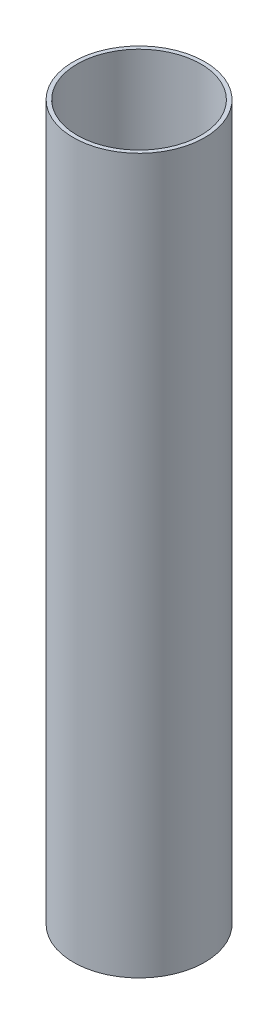
ISO-10303-21;
HEADER;
FILE_DESCRIPTION(('STEP AP214'),'2;1');
FILE_NAME('part.step','',(''),(''),'','','');
FILE_SCHEMA(('AUTOMOTIVE_DESIGN { 1 0 10303 214 1 1 1 1 }'));
ENDSEC;
DATA;
#1=APPLICATION_CONTEXT('core data for automotive mechanical design processes');
#2=APPLICATION_PROTOCOL_DEFINITION('international standard','automotive_design',2000,#1);
#3=PRODUCT_CONTEXT('',#1,'mechanical');
#4=PRODUCT('Part','Part','',(#3));
#5=PRODUCT_RELATED_PRODUCT_CATEGORY('part','',(#4));
#6=PRODUCT_DEFINITION_FORMATION('','',#4);
#7=PRODUCT_DEFINITION_CONTEXT('part definition',#1,'design');
#8=PRODUCT_DEFINITION('design','',#6,#7);
#9=PRODUCT_DEFINITION_SHAPE('','',#8);
#10=(LENGTH_UNIT() NAMED_UNIT(*) SI_UNIT(.MILLI.,.METRE.));
#11=(NAMED_UNIT(*) PLANE_ANGLE_UNIT() SI_UNIT($,.RADIAN.));
#12=(NAMED_UNIT(*) SI_UNIT($,.STERADIAN.) SOLID_ANGLE_UNIT());
#13=UNCERTAINTY_MEASURE_WITH_UNIT(LENGTH_MEASURE(1.E-05),#10,'distance_accuracy_value','');
#14=(GEOMETRIC_REPRESENTATION_CONTEXT(3) GLOBAL_UNCERTAINTY_ASSIGNED_CONTEXT((#13)) GLOBAL_UNIT_ASSIGNED_CONTEXT((#10,
#11,#12)) REPRESENTATION_CONTEXT('',''));
#15=CARTESIAN_POINT('',(0.,0.,0.));
#16=DIRECTION('',(0.,0.,1.));
#17=DIRECTION('',(1.,0.,0.));
#18=AXIS2_PLACEMENT_3D('',#15,#16,#17);
#19=CARTESIAN_POINT('',(0.,35.7873752900024,0.));
#20=DIRECTION('',(0.,1.,0.));
#21=DIRECTION('',(0.,0.,1.));
#22=AXIS2_PLACEMENT_3D('',#19,#20,#21);
#23=PLANE('',#22);
#24=CARTESIAN_POINT('',(0.,35.7873752900024,0.));
#25=DIRECTION('',(0.,1.,0.));
#26=DIRECTION('',(0.,0.,1.));
#27=AXIS2_PLACEMENT_3D('',#24,#25,#26);
#28=CIRCLE('',#27,12.55);
#29=CARTESIAN_POINT('',(0.,35.7873752900024,12.55));
#30=VERTEX_POINT('',#29);
#31=EDGE_CURVE('E43',#30,#30,#28,.T.);
#32=ORIENTED_EDGE('',*,*,#31,.T.);
#33=EDGE_LOOP('',(#32));
#34=FACE_BOUND('',#33,.T.);
#35=CARTESIAN_POINT('',(0.,35.7873752900024,0.));
#36=DIRECTION('',(0.,-1.,0.));
#37=DIRECTION('',(0.,0.,-1.));
#38=AXIS2_PLACEMENT_3D('',#35,#36,#37);
#39=CIRCLE('',#38,13.35);
#40=CARTESIAN_POINT('',(0.,35.7873752900024,-13.35));
#41=VERTEX_POINT('',#40);
#42=EDGE_CURVE('E39',#41,#41,#39,.T.);
#43=ORIENTED_EDGE('',*,*,#42,.T.);
#44=EDGE_LOOP('',(#43));
#45=FACE_BOUND('',#44,.T.);
#46=ADVANCED_FACE('F33',(#34,#45),#23,.F.);
#47=CARTESIAN_POINT('',(0.,180.787375290002,0.));
#48=DIRECTION('',(0.,1.,0.));
#49=DIRECTION('',(0.,0.,1.));
#50=AXIS2_PLACEMENT_3D('',#47,#48,#49);
#51=PLANE('',#50);
#52=CARTESIAN_POINT('',(0.,180.787375290002,0.));
#53=DIRECTION('',(0.,1.,0.));
#54=DIRECTION('',(0.,0.,1.));
#55=AXIS2_PLACEMENT_3D('',#52,#53,#54);
#56=CIRCLE('',#55,12.55);
#57=CARTESIAN_POINT('',(0.,180.787375290002,12.55));
#58=VERTEX_POINT('',#57);
#59=EDGE_CURVE('E47',#58,#58,#56,.T.);
#60=ORIENTED_EDGE('',*,*,#59,.F.);
#61=EDGE_LOOP('',(#60));
#62=FACE_BOUND('',#61,.T.);
#63=CARTESIAN_POINT('',(0.,180.787375290002,0.));
#64=DIRECTION('',(0.,-1.,0.));
#65=DIRECTION('',(0.,0.,-1.));
#66=AXIS2_PLACEMENT_3D('',#63,#64,#65);
#67=CIRCLE('',#66,13.35);
#68=CARTESIAN_POINT('',(0.,180.787375290002,-13.35));
#69=VERTEX_POINT('',#68);
#70=EDGE_CURVE('E10',#69,#69,#67,.T.);
#71=ORIENTED_EDGE('',*,*,#70,.F.);
#72=EDGE_LOOP('',(#71));
#73=FACE_BOUND('',#72,.T.);
#74=ADVANCED_FACE('F56',(#62,#73),#51,.T.);
#75=CARTESIAN_POINT('',(0.,0.,0.));
#76=DIRECTION('',(0.,-1.,0.));
#77=DIRECTION('',(0.,0.,-1.));
#78=AXIS2_PLACEMENT_3D('',#75,#76,#77);
#79=CYLINDRICAL_SURFACE('',#78,13.35);
#80=ORIENTED_EDGE('',*,*,#70,.T.);
#81=EDGE_LOOP('',(#80));
#82=FACE_BOUND('',#81,.T.);
#83=ORIENTED_EDGE('',*,*,#42,.F.);
#84=EDGE_LOOP('',(#83));
#85=FACE_BOUND('',#84,.T.);
#86=ADVANCED_FACE('F59',(#82,#85),#79,.T.);
#87=CARTESIAN_POINT('',(0.,22.7873752900024,0.));
#88=DIRECTION('',(0.,1.,0.));
#89=DIRECTION('',(0.,0.,1.));
#90=AXIS2_PLACEMENT_3D('',#87,#88,#89);
#91=CYLINDRICAL_SURFACE('',#90,12.55);
#92=ORIENTED_EDGE('',*,*,#59,.T.);
#93=EDGE_LOOP('',(#92));
#94=FACE_BOUND('',#93,.T.);
#95=ORIENTED_EDGE('',*,*,#31,.F.);
#96=EDGE_LOOP('',(#95));
#97=FACE_BOUND('',#96,.T.);
#98=ADVANCED_FACE('F53',(#94,#97),#91,.F.);
#99=CLOSED_SHELL('',(#46,#74,#86,#98));
#100=MANIFOLD_SOLID_BREP('B2',#99);
#101=ADVANCED_BREP_SHAPE_REPRESENTATION('',(#18,#100),#14);
#102=SHAPE_DEFINITION_REPRESENTATION(#9,#101);
ENDSEC;
END-ISO-10303-21;
